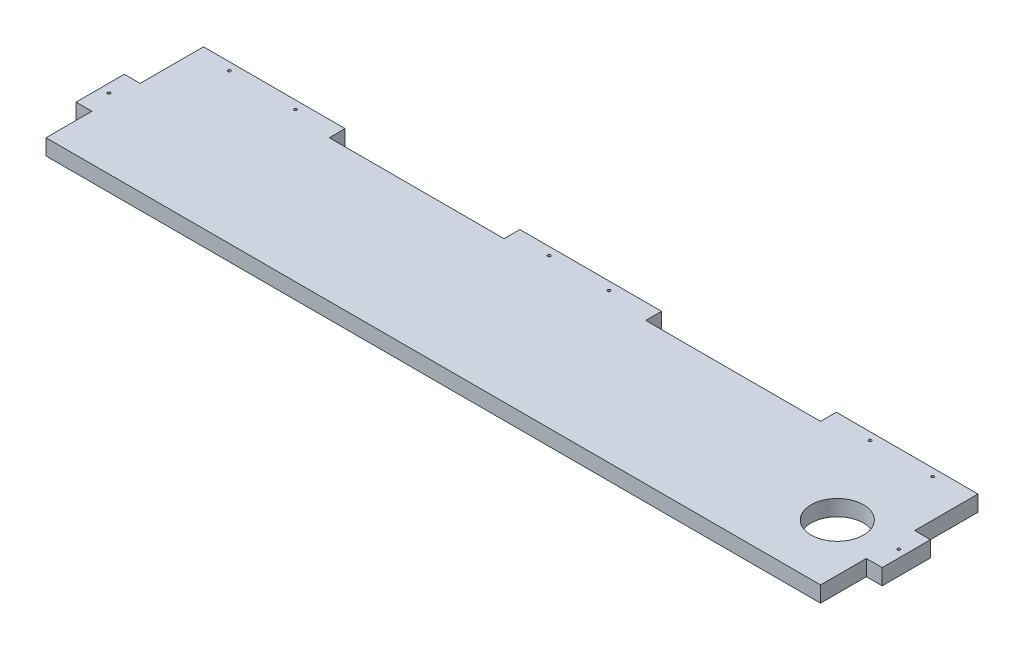
ISO-10303-21;
HEADER;
FILE_DESCRIPTION(('STEP AP214'),'2;1');
FILE_NAME('part.step','',(''),(''),'','','');
FILE_SCHEMA(('AUTOMOTIVE_DESIGN { 1 0 10303 214 1 1 1 1 }'));
ENDSEC;
DATA;
#1=APPLICATION_CONTEXT('core data for automotive mechanical design processes');
#2=APPLICATION_PROTOCOL_DEFINITION('international standard','automotive_design',2000,#1);
#3=PRODUCT_CONTEXT('',#1,'mechanical');
#4=PRODUCT('Part','Part','',(#3));
#5=PRODUCT_RELATED_PRODUCT_CATEGORY('part','',(#4));
#6=PRODUCT_DEFINITION_FORMATION('','',#4);
#7=PRODUCT_DEFINITION_CONTEXT('part definition',#1,'design');
#8=PRODUCT_DEFINITION('design','',#6,#7);
#9=PRODUCT_DEFINITION_SHAPE('','',#8);
#10=(LENGTH_UNIT() NAMED_UNIT(*) SI_UNIT(.MILLI.,.METRE.));
#11=(NAMED_UNIT(*) PLANE_ANGLE_UNIT() SI_UNIT($,.RADIAN.));
#12=(NAMED_UNIT(*) SI_UNIT($,.STERADIAN.) SOLID_ANGLE_UNIT());
#13=UNCERTAINTY_MEASURE_WITH_UNIT(LENGTH_MEASURE(1.E-05),#10,'distance_accuracy_value','');
#14=(GEOMETRIC_REPRESENTATION_CONTEXT(3) GLOBAL_UNCERTAINTY_ASSIGNED_CONTEXT((#13)) GLOBAL_UNIT_ASSIGNED_CONTEXT((#10,
#11,#12)) REPRESENTATION_CONTEXT('',''));
#15=CARTESIAN_POINT('',(0.,0.,0.));
#16=DIRECTION('',(0.,0.,1.));
#17=DIRECTION('',(1.,0.,0.));
#18=AXIS2_PLACEMENT_3D('',#15,#16,#17);
#19=CARTESIAN_POINT('',(-1878.01840884108,3374.03154429096,189.));
#20=DIRECTION('',(0.,-1.,0.));
#21=DIRECTION('',(0.,0.,-1.));
#22=AXIS2_PLACEMENT_3D('',#19,#20,#21);
#23=PLANE('',#22);
#24=CARTESIAN_POINT('',(-993.687537487218,3374.03154429096,9.0847005836633));
#25=DIRECTION('',(0.,1.,0.));
#26=DIRECTION('',(0.,0.,1.));
#27=AXIS2_PLACEMENT_3D('',#24,#25,#26);
#28=CIRCLE('',#27,1.70000000000003);
#29=CARTESIAN_POINT('',(-993.687537487218,3374.03154429096,10.7847005836633));
#30=VERTEX_POINT('',#29);
#31=EDGE_CURVE('E717',#30,#30,#28,.T.);
#32=ORIENTED_EDGE('',*,*,#31,.F.);
#33=EDGE_LOOP('',(#32));
#34=FACE_BOUND('',#33,.T.);
#35=CARTESIAN_POINT('',(-1068.92238905759,3374.03154429096,9.0847005836633));
#36=DIRECTION('',(0.,1.,0.));
#37=DIRECTION('',(0.,0.,1.));
#38=AXIS2_PLACEMENT_3D('',#35,#36,#37);
#39=CIRCLE('',#38,1.70000000000003);
#40=CARTESIAN_POINT('',(-1068.92238905759,3374.03154429096,10.7847005836633));
#41=VERTEX_POINT('',#40);
#42=EDGE_CURVE('E719',#41,#41,#39,.T.);
#43=ORIENTED_EDGE('',*,*,#42,.F.);
#44=EDGE_LOOP('',(#43));
#45=FACE_BOUND('',#44,.T.);
#46=CARTESIAN_POINT('',(-1453.57381328359,3374.03154429096,9.61452348204585));
#47=DIRECTION('',(0.,1.,0.));
#48=DIRECTION('',(0.,0.,1.));
#49=AXIS2_PLACEMENT_3D('',#46,#47,#48);
#50=CIRCLE('',#49,1.70000000000003);
#51=CARTESIAN_POINT('',(-1453.57381328359,3374.03154429096,11.3145234820459));
#52=VERTEX_POINT('',#51);
#53=EDGE_CURVE('E725',#52,#52,#50,.T.);
#54=ORIENTED_EDGE('',*,*,#53,.F.);
#55=EDGE_LOOP('',(#54));
#56=FACE_BOUND('',#55,.T.);
#57=CARTESIAN_POINT('',(-1757.52295911213,3374.03154429096,9.98064592888394));
#58=DIRECTION('',(0.,1.,0.));
#59=DIRECTION('',(0.,0.,1.));
#60=AXIS2_PLACEMENT_3D('',#57,#58,#59);
#61=CIRCLE('',#60,1.70000000000003);
#62=CARTESIAN_POINT('',(-1757.52295911213,3374.03154429096,11.680645928884));
#63=VERTEX_POINT('',#62);
#64=EDGE_CURVE('E729',#63,#63,#61,.T.);
#65=ORIENTED_EDGE('',*,*,#64,.F.);
#66=EDGE_LOOP('',(#65));
#67=FACE_BOUND('',#66,.T.);
#68=CARTESIAN_POINT('',(-1837.60945529256,3374.03154429096,9.35497017747501));
#69=DIRECTION('',(0.,1.,0.));
#70=DIRECTION('',(0.,0.,1.));
#71=AXIS2_PLACEMENT_3D('',#68,#69,#70);
#72=CIRCLE('',#71,1.70000000000003);
#73=CARTESIAN_POINT('',(-1837.60945529256,3374.03154429096,11.054970177475));
#74=VERTEX_POINT('',#73);
#75=EDGE_CURVE('E733',#74,#74,#72,.T.);
#76=ORIENTED_EDGE('',*,*,#75,.F.);
#77=EDGE_LOOP('',(#76));
#78=FACE_BOUND('',#77,.T.);
#79=CARTESIAN_POINT('',(-1381.23942270364,3374.03154429096,10.0245755343759));
#80=DIRECTION('',(0.,1.,0.));
#81=DIRECTION('',(0.,0.,1.));
#82=AXIS2_PLACEMENT_3D('',#79,#80,#81);
#83=CIRCLE('',#82,1.70000000000003);
#84=CARTESIAN_POINT('',(-1381.23942270364,3374.03154429096,11.7245755343759));
#85=VERTEX_POINT('',#84);
#86=EDGE_CURVE('E737',#85,#85,#83,.T.);
#87=ORIENTED_EDGE('',*,*,#86,.F.);
#88=EDGE_LOOP('',(#87));
#89=FACE_BOUND('',#88,.T.);
#90=CARTESIAN_POINT('',(-938.477894694233,3374.03154429096,104.971595660942));
#91=DIRECTION('',(0.,1.,0.));
#92=DIRECTION('',(0.,0.,1.));
#93=AXIS2_PLACEMENT_3D('',#90,#91,#92);
#94=CIRCLE('',#93,1.70000000000003);
#95=CARTESIAN_POINT('',(-938.477894694233,3374.03154429096,106.671595660942));
#96=VERTEX_POINT('',#95);
#97=EDGE_CURVE('E741',#96,#96,#94,.T.);
#98=ORIENTED_EDGE('',*,*,#97,.F.);
#99=EDGE_LOOP('',(#98));
#100=FACE_BOUND('',#99,.T.);
#101=CARTESIAN_POINT('',(-1005.92382658818,3374.03154429096,111.37088114683));
#102=DIRECTION('',(0.,1.,0.));
#103=DIRECTION('',(0.,0.,1.));
#104=AXIS2_PLACEMENT_3D('',#101,#102,#103);
#105=CIRCLE('',#104,31.4746452947954);
#106=CARTESIAN_POINT('',(-1005.92382658818,3374.03154429096,142.845526441626));
#107=VERTEX_POINT('',#106);
#108=EDGE_CURVE('E193',#107,#107,#105,.T.);
#109=ORIENTED_EDGE('',*,*,#108,.F.);
#110=EDGE_LOOP('',(#109));
#111=FACE_BOUND('',#110,.T.);
#112=DIRECTION('',(0.,0.,-1.));
#113=VECTOR('',#112,1.);
#114=CARTESIAN_POINT('',(-948.418408841076,3374.03154429096,189.));
#115=LINE('',#114,#113);
#116=CARTESIAN_POINT('',(-948.418408841076,3374.03154429096,189.));
#117=VERTEX_POINT('',#116);
#118=CARTESIAN_POINT('',(-948.418408841076,3374.03154429096,134.));
#119=VERTEX_POINT('',#118);
#120=EDGE_CURVE('E349',#117,#119,#115,.T.);
#121=ORIENTED_EDGE('',*,*,#120,.T.);
#122=DIRECTION('',(-1.,0.,0.));
#123=VECTOR('',#122,1.);
#124=CARTESIAN_POINT('',(-929.418408841076,3374.03154429096,134.));
#125=LINE('',#124,#123);
#126=CARTESIAN_POINT('',(-929.418408841076,3374.03154429096,134.));
#127=VERTEX_POINT('',#126);
#128=EDGE_CURVE('E751',#127,#119,#125,.T.);
#129=ORIENTED_EDGE('',*,*,#128,.F.);
#130=DIRECTION('',(0.,0.,1.));
#131=VECTOR('',#130,1.);
#132=CARTESIAN_POINT('',(-929.418408841076,3374.03154429096,134.));
#133=LINE('',#132,#131);
#134=CARTESIAN_POINT('',(-929.418408841076,3374.03154429096,76.));
#135=VERTEX_POINT('',#134);
#136=EDGE_CURVE('E187',#135,#127,#133,.T.);
#137=ORIENTED_EDGE('',*,*,#136,.F.);
#138=DIRECTION('',(-1.,0.,0.));
#139=VECTOR('',#138,1.);
#140=CARTESIAN_POINT('',(-929.418408841076,3374.03154429096,76.));
#141=LINE('',#140,#139);
#142=CARTESIAN_POINT('',(-948.418408841076,3374.03154429096,76.));
#143=VERTEX_POINT('',#142);
#144=EDGE_CURVE('E198',#135,#143,#141,.T.);
#145=ORIENTED_EDGE('',*,*,#144,.T.);
#146=CARTESIAN_POINT('',(-948.418408841076,3374.03154429096,0.));
#147=VERTEX_POINT('',#146);
#148=EDGE_CURVE('E348',#143,#147,#115,.T.);
#149=ORIENTED_EDGE('',*,*,#148,.T.);
#150=DIRECTION('',(1.,0.,0.));
#151=VECTOR('',#150,1.);
#152=CARTESIAN_POINT('',(-1118.41840884108,3374.03154429096,0.));
#153=LINE('',#152,#151);
#154=CARTESIAN_POINT('',(-1118.41840884108,3374.03154429096,0.));
#155=VERTEX_POINT('',#154);
#156=EDGE_CURVE('E218',#155,#147,#153,.T.);
#157=ORIENTED_EDGE('',*,*,#156,.F.);
#158=DIRECTION('',(0.,0.,1.));
#159=VECTOR('',#158,1.);
#160=CARTESIAN_POINT('',(-1118.41840884108,3374.03154429096,-19.));
#161=LINE('',#160,#159);
#162=CARTESIAN_POINT('',(-1118.41840884108,3374.03154429096,19.));
#163=VERTEX_POINT('',#162);
#164=EDGE_CURVE('E210',#155,#163,#161,.T.);
#165=ORIENTED_EDGE('',*,*,#164,.T.);
#166=DIRECTION('',(-1.,0.,0.));
#167=VECTOR('',#166,1.);
#168=CARTESIAN_POINT('',(-1878.01840884108,3374.03154429096,19.));
#169=LINE('',#168,#167);
#170=CARTESIAN_POINT('',(-1328.21840884108,3374.03154429096,19.));
#171=VERTEX_POINT('',#170);
#172=EDGE_CURVE('E333',#163,#171,#169,.T.);
#173=ORIENTED_EDGE('',*,*,#172,.T.);
#174=DIRECTION('',(0.,0.,1.));
#175=VECTOR('',#174,1.);
#176=CARTESIAN_POINT('',(-1328.21840884108,3374.03154429096,-19.));
#177=LINE('',#176,#175);
#178=CARTESIAN_POINT('',(-1328.21840884108,3374.03154429096,0.));
#179=VERTEX_POINT('',#178);
#180=EDGE_CURVE('E237',#179,#171,#177,.T.);
#181=ORIENTED_EDGE('',*,*,#180,.F.);
#182=DIRECTION('',(1.,0.,0.));
#183=VECTOR('',#182,1.);
#184=CARTESIAN_POINT('',(-1498.21840884108,3374.03154429096,0.));
#185=LINE('',#184,#183);
#186=CARTESIAN_POINT('',(-1498.21840884108,3374.03154429096,0.));
#187=VERTEX_POINT('',#186);
#188=EDGE_CURVE('E254',#187,#179,#185,.T.);
#189=ORIENTED_EDGE('',*,*,#188,.F.);
#190=DIRECTION('',(0.,0.,1.));
#191=VECTOR('',#190,1.);
#192=CARTESIAN_POINT('',(-1498.21840884108,3374.03154429096,-19.));
#193=LINE('',#192,#191);
#194=CARTESIAN_POINT('',(-1498.21840884108,3374.03154429096,19.));
#195=VERTEX_POINT('',#194);
#196=EDGE_CURVE('E246',#187,#195,#193,.T.);
#197=ORIENTED_EDGE('',*,*,#196,.T.);
#198=CARTESIAN_POINT('',(-1708.01840884108,3374.03154429096,19.));
#199=VERTEX_POINT('',#198);
#200=EDGE_CURVE('E343',#195,#199,#169,.T.);
#201=ORIENTED_EDGE('',*,*,#200,.T.);
#202=DIRECTION('',(0.,0.,1.));
#203=VECTOR('',#202,1.);
#204=CARTESIAN_POINT('',(-1708.01840884108,3374.03154429096,-19.));
#205=LINE('',#204,#203);
#206=CARTESIAN_POINT('',(-1708.01840884108,3374.03154429096,0.));
#207=VERTEX_POINT('',#206);
#208=EDGE_CURVE('E253',#207,#199,#205,.T.);
#209=ORIENTED_EDGE('',*,*,#208,.F.);
#210=DIRECTION('',(1.,0.,0.));
#211=VECTOR('',#210,1.);
#212=CARTESIAN_POINT('',(-1878.01840884108,3374.03154429096,0.));
#213=LINE('',#212,#211);
#214=CARTESIAN_POINT('',(-1878.01840884108,3374.03154429096,0.));
#215=VERTEX_POINT('',#214);
#216=EDGE_CURVE('E284',#215,#207,#213,.T.);
#217=ORIENTED_EDGE('',*,*,#216,.F.);
#218=DIRECTION('',(0.,0.,-1.));
#219=VECTOR('',#218,1.);
#220=CARTESIAN_POINT('',(-1878.01840884108,3374.03154429096,189.));
#221=LINE('',#220,#219);
#222=CARTESIAN_POINT('',(-1878.01840884108,3374.03154429096,76.));
#223=VERTEX_POINT('',#222);
#224=EDGE_CURVE('E339',#223,#215,#221,.T.);
#225=ORIENTED_EDGE('',*,*,#224,.F.);
#226=DIRECTION('',(1.,0.,0.));
#227=VECTOR('',#226,1.);
#228=CARTESIAN_POINT('',(-1916.01840884108,3374.03154429096,76.));
#229=LINE('',#228,#227);
#230=CARTESIAN_POINT('',(-1897.01840884108,3374.03154429096,76.));
#231=VERTEX_POINT('',#230);
#232=EDGE_CURVE('E317',#231,#223,#229,.T.);
#233=ORIENTED_EDGE('',*,*,#232,.F.);
#234=DIRECTION('',(0.,0.,-1.));
#235=VECTOR('',#234,1.);
#236=CARTESIAN_POINT('',(-1897.01840884108,3374.03154429096,76.));
#237=LINE('',#236,#235);
#238=CARTESIAN_POINT('',(-1897.01840884108,3374.03154429096,134.));
#239=VERTEX_POINT('',#238);
#240=EDGE_CURVE('E304',#239,#231,#237,.T.);
#241=ORIENTED_EDGE('',*,*,#240,.F.);
#242=DIRECTION('',(1.,0.,0.));
#243=VECTOR('',#242,1.);
#244=CARTESIAN_POINT('',(-1916.01840884108,3374.03154429096,134.));
#245=LINE('',#244,#243);
#246=CARTESIAN_POINT('',(-1878.01840884108,3374.03154429096,134.));
#247=VERTEX_POINT('',#246);
#248=EDGE_CURVE('E324',#239,#247,#245,.T.);
#249=ORIENTED_EDGE('',*,*,#248,.T.);
#250=CARTESIAN_POINT('',(-1878.01840884108,3374.03154429096,189.));
#251=VERTEX_POINT('',#250);
#252=EDGE_CURVE('E345',#251,#247,#221,.T.);
#253=ORIENTED_EDGE('',*,*,#252,.F.);
#254=DIRECTION('',(-1.,0.,0.));
#255=VECTOR('',#254,1.);
#256=CARTESIAN_POINT('',(-1878.01840884108,3374.03154429096,189.));
#257=LINE('',#256,#255);
#258=EDGE_CURVE('E337',#117,#251,#257,.T.);
#259=ORIENTED_EDGE('',*,*,#258,.F.);
#260=EDGE_LOOP('',(#121,#129,#137,#145,#149,#157,#165,#173,#181,#189,#197,#201,#209,#217,#225,
#233,#241,#249,#253,#259));
#261=FACE_BOUND('',#260,.T.);
#262=CARTESIAN_POINT('',(-1886.75619490167,3374.03154429096,104.854140946122));
#263=DIRECTION('',(0.,1.,0.));
#264=DIRECTION('',(0.,0.,1.));
#265=AXIS2_PLACEMENT_3D('',#262,#263,#264);
#266=CIRCLE('',#265,1.70000000000003);
#267=CARTESIAN_POINT('',(-1886.75619490167,3374.03154429096,106.554140946122));
#268=VERTEX_POINT('',#267);
#269=EDGE_CURVE('E745',#268,#268,#266,.T.);
#270=ORIENTED_EDGE('',*,*,#269,.F.);
#271=EDGE_LOOP('',(#270));
#272=FACE_BOUND('',#271,.T.);
#273=ADVANCED_FACE('F33',(#34,#45,#56,#67,#78,#89,#100,#111,#261,#272),#23,.F.);
#274=CARTESIAN_POINT('',(-948.418408841076,3374.03154429096,189.));
#275=DIRECTION('',(-1.,0.,0.));
#276=DIRECTION('',(0.,-1.,0.));
#277=AXIS2_PLACEMENT_3D('',#274,#275,#276);
#278=PLANE('',#277);
#279=DIRECTION('',(0.,-1.,0.));
#280=VECTOR('',#279,1.);
#281=CARTESIAN_POINT('',(-948.418408841076,3374.03154429096,134.));
#282=LINE('',#281,#280);
#283=CARTESIAN_POINT('',(-948.418408841076,3355.03154429096,134.));
#284=VERTEX_POINT('',#283);
#285=EDGE_CURVE('E48',#119,#284,#282,.T.);
#286=ORIENTED_EDGE('',*,*,#285,.F.);
#287=ORIENTED_EDGE('',*,*,#120,.F.);
#288=DIRECTION('',(0.,1.,0.));
#289=VECTOR('',#288,1.);
#290=CARTESIAN_POINT('',(-948.418408841076,3374.03154429096,189.));
#291=LINE('',#290,#289);
#292=CARTESIAN_POINT('',(-948.418408841076,3355.03154429096,189.));
#293=VERTEX_POINT('',#292);
#294=EDGE_CURVE('E335',#293,#117,#291,.T.);
#295=ORIENTED_EDGE('',*,*,#294,.F.);
#296=DIRECTION('',(0.,0.,-1.));
#297=VECTOR('',#296,1.);
#298=CARTESIAN_POINT('',(-948.418408841076,3355.03154429096,189.));
#299=LINE('',#298,#297);
#300=EDGE_CURVE('E351',#293,#284,#299,.T.);
#301=ORIENTED_EDGE('',*,*,#300,.T.);
#302=EDGE_LOOP('',(#286,#287,#295,#301));
#303=FACE_BOUND('',#302,.T.);
#304=ADVANCED_FACE('F417',(#303),#278,.F.);
#305=DIRECTION('',(0.,1.,0.));
#306=VECTOR('',#305,1.);
#307=CARTESIAN_POINT('',(-948.418408841076,3374.03154429096,76.));
#308=LINE('',#307,#306);
#309=CARTESIAN_POINT('',(-948.418408841076,3355.03154429096,76.));
#310=VERTEX_POINT('',#309);
#311=EDGE_CURVE('E56',#310,#143,#308,.T.);
#312=ORIENTED_EDGE('',*,*,#311,.F.);
#313=CARTESIAN_POINT('',(-948.418408841076,3355.03154429096,0.));
#314=VERTEX_POINT('',#313);
#315=EDGE_CURVE('E350',#310,#314,#299,.T.);
#316=ORIENTED_EDGE('',*,*,#315,.T.);
#317=DIRECTION('',(0.,-1.,0.));
#318=VECTOR('',#317,1.);
#319=CARTESIAN_POINT('',(-948.418408841076,3374.03154429096,0.));
#320=LINE('',#319,#318);
#321=EDGE_CURVE('E211',#147,#314,#320,.T.);
#322=ORIENTED_EDGE('',*,*,#321,.F.);
#323=ORIENTED_EDGE('',*,*,#148,.F.);
#324=EDGE_LOOP('',(#312,#316,#322,#323));
#325=FACE_BOUND('',#324,.T.);
#326=ADVANCED_FACE('F355',(#325),#278,.F.);
#327=CARTESIAN_POINT('',(0.,0.,19.));
#328=DIRECTION('',(0.,0.,1.));
#329=DIRECTION('',(1.,0.,0.));
#330=AXIS2_PLACEMENT_3D('',#327,#328,#329);
#331=PLANE('',#330);
#332=CARTESIAN_POINT('',(-1118.41840884108,3355.03154429096,19.));
#333=CARTESIAN_POINT('',(-1118.41840884108,3374.03154429096,19.));
#334=B_SPLINE_CURVE_WITH_KNOTS('',1,(#332,#333),.UNSPECIFIED.,.F.,.F.,(2,2),(0.,
0.0502645502645506),.UNSPECIFIED.);
#335=CARTESIAN_POINT('',(-1118.41840884108,3355.03154429096,19.));
#336=VERTEX_POINT('',#335);
#337=EDGE_CURVE('E205',#336,#163,#334,.T.);
#338=ORIENTED_EDGE('',*,*,#337,.F.);
#339=DIRECTION('',(1.,0.,0.));
#340=VECTOR('',#339,1.);
#341=CARTESIAN_POINT('',(-1878.01840884108,3355.03154429096,19.));
#342=LINE('',#341,#340);
#343=CARTESIAN_POINT('',(-1328.21840884108,3355.03154429096,19.));
#344=VERTEX_POINT('',#343);
#345=EDGE_CURVE('E328',#344,#336,#342,.T.);
#346=ORIENTED_EDGE('',*,*,#345,.F.);
#347=CARTESIAN_POINT('',(-1328.21840884108,3374.03154429096,19.));
#348=CARTESIAN_POINT('',(-1328.21840884108,3355.03154429096,19.));
#349=B_SPLINE_CURVE_WITH_KNOTS('',1,(#347,#348),.UNSPECIFIED.,.F.,.F.,(2,2),(0.5,
0.550264550264551),.UNSPECIFIED.);
#350=EDGE_CURVE('E231',#171,#344,#349,.T.);
#351=ORIENTED_EDGE('',*,*,#350,.F.);
#352=ORIENTED_EDGE('',*,*,#172,.F.);
#353=EDGE_LOOP('',(#338,#346,#351,#352));
#354=FACE_BOUND('',#353,.T.);
#355=ADVANCED_FACE('F367',(#354),#331,.F.);
#356=CARTESIAN_POINT('',(-1498.21840884108,3355.03154429096,19.));
#357=CARTESIAN_POINT('',(-1498.21840884108,3374.03154429096,19.));
#358=B_SPLINE_CURVE_WITH_KNOTS('',1,(#356,#357),.UNSPECIFIED.,.F.,.F.,(2,2),(0.,
0.0502645502645506),.UNSPECIFIED.);
#359=CARTESIAN_POINT('',(-1498.21840884108,3355.03154429096,19.));
#360=VERTEX_POINT('',#359);
#361=EDGE_CURVE('E238',#360,#195,#358,.T.);
#362=ORIENTED_EDGE('',*,*,#361,.F.);
#363=CARTESIAN_POINT('',(-1708.01840884108,3355.03154429096,19.));
#364=VERTEX_POINT('',#363);
#365=EDGE_CURVE('E340',#364,#360,#342,.T.);
#366=ORIENTED_EDGE('',*,*,#365,.F.);
#367=CARTESIAN_POINT('',(-1708.01840884108,3374.03154429096,19.));
#368=CARTESIAN_POINT('',(-1708.01840884108,3355.03154429096,19.));
#369=B_SPLINE_CURVE_WITH_KNOTS('',1,(#367,#368),.UNSPECIFIED.,.F.,.F.,(2,2),(0.5,
0.550264550264551),.UNSPECIFIED.);
#370=EDGE_CURVE('E271',#199,#364,#369,.T.);
#371=ORIENTED_EDGE('',*,*,#370,.F.);
#372=ORIENTED_EDGE('',*,*,#200,.F.);
#373=EDGE_LOOP('',(#362,#366,#371,#372));
#374=FACE_BOUND('',#373,.T.);
#375=ADVANCED_FACE('F383',(#374),#331,.F.);
#376=CARTESIAN_POINT('',(-1878.01840884108,3374.03154429096,189.));
#377=DIRECTION('',(1.,0.,0.));
#378=DIRECTION('',(0.,0.,-1.));
#379=AXIS2_PLACEMENT_3D('',#376,#377,#378);
#380=PLANE('',#379);
#381=DIRECTION('',(0.,0.,-1.));
#382=VECTOR('',#381,1.);
#383=CARTESIAN_POINT('',(-1878.01840884108,3355.03154429096,189.));
#384=LINE('',#383,#382);
#385=CARTESIAN_POINT('',(-1878.01840884108,3355.03154429096,76.));
#386=VERTEX_POINT('',#385);
#387=CARTESIAN_POINT('',(-1878.01840884108,3355.03154429096,0.));
#388=VERTEX_POINT('',#387);
#389=EDGE_CURVE('E41',#386,#388,#384,.T.);
#390=ORIENTED_EDGE('',*,*,#389,.F.);
#391=CARTESIAN_POINT('',(-1878.01840884108,3355.03154429096,76.));
#392=CARTESIAN_POINT('',(-1878.01840884108,3374.03154429096,76.));
#393=B_SPLINE_CURVE_WITH_KNOTS('',1,(#391,#392),.UNSPECIFIED.,.F.,.F.,(2,2),(0.,
0.123376623376624),.UNSPECIFIED.);
#394=EDGE_CURVE('E283',#386,#223,#393,.T.);
#395=ORIENTED_EDGE('',*,*,#394,.T.);
#396=ORIENTED_EDGE('',*,*,#224,.T.);
#397=DIRECTION('',(0.,1.,0.));
#398=VECTOR('',#397,1.);
#399=CARTESIAN_POINT('',(-1878.01840884108,3355.03154429096,0.));
#400=LINE('',#399,#398);
#401=EDGE_CURVE('E287',#388,#215,#400,.T.);
#402=ORIENTED_EDGE('',*,*,#401,.F.);
#403=EDGE_LOOP('',(#390,#395,#396,#402));
#404=FACE_BOUND('',#403,.T.);
#405=ADVANCED_FACE('F395',(#404),#380,.F.);
#406=ORIENTED_EDGE('',*,*,#252,.T.);
#407=CARTESIAN_POINT('',(-1878.01840884108,3374.03154429096,134.));
#408=CARTESIAN_POINT('',(-1878.01840884108,3355.03154429096,134.));
#409=B_SPLINE_CURVE_WITH_KNOTS('',1,(#407,#408),.UNSPECIFIED.,.F.,.F.,(2,2),(0.5,
0.623376623376624),.UNSPECIFIED.);
#410=CARTESIAN_POINT('',(-1878.01840884108,3355.03154429096,134.));
#411=VERTEX_POINT('',#410);
#412=EDGE_CURVE('E309',#247,#411,#409,.T.);
#413=ORIENTED_EDGE('',*,*,#412,.T.);
#414=CARTESIAN_POINT('',(-1878.01840884108,3355.03154429096,189.));
#415=VERTEX_POINT('',#414);
#416=EDGE_CURVE('E11',#415,#411,#384,.T.);
#417=ORIENTED_EDGE('',*,*,#416,.F.);
#418=DIRECTION('',(0.,-1.,0.));
#419=VECTOR('',#418,1.);
#420=CARTESIAN_POINT('',(-1878.01840884108,3374.03154429096,189.));
#421=LINE('',#420,#419);
#422=EDGE_CURVE('E329',#251,#415,#421,.T.);
#423=ORIENTED_EDGE('',*,*,#422,.F.);
#424=EDGE_LOOP('',(#406,#413,#417,#423));
#425=FACE_BOUND('',#424,.T.);
#426=ADVANCED_FACE('F35',(#425),#380,.F.);
#427=CARTESIAN_POINT('',(-1878.01840884108,3355.03154429096,189.));
#428=DIRECTION('',(0.,1.,0.));
#429=DIRECTION('',(0.,0.,1.));
#430=AXIS2_PLACEMENT_3D('',#427,#428,#429);
#431=PLANE('',#430);
#432=CARTESIAN_POINT('',(-993.687537487218,3355.03154429096,9.0847005836633));
#433=DIRECTION('',(0.,1.,0.));
#434=DIRECTION('',(0.,0.,1.));
#435=AXIS2_PLACEMENT_3D('',#432,#433,#434);
#436=CIRCLE('',#435,1.70000000000003);
#437=CARTESIAN_POINT('',(-993.687537487218,3355.03154429096,10.7847005836633));
#438=VERTEX_POINT('',#437);
#439=EDGE_CURVE('E437',#438,#438,#436,.T.);
#440=ORIENTED_EDGE('',*,*,#439,.T.);
#441=EDGE_LOOP('',(#440));
#442=FACE_BOUND('',#441,.T.);
#443=CARTESIAN_POINT('',(-1068.92238905759,3355.03154429096,9.0847005836633));
#444=DIRECTION('',(0.,1.,0.));
#445=DIRECTION('',(0.,0.,1.));
#446=AXIS2_PLACEMENT_3D('',#443,#444,#445);
#447=CIRCLE('',#446,1.70000000000003);
#448=CARTESIAN_POINT('',(-1068.92238905759,3355.03154429096,10.7847005836633));
#449=VERTEX_POINT('',#448);
#450=EDGE_CURVE('E441',#449,#449,#447,.T.);
#451=ORIENTED_EDGE('',*,*,#450,.T.);
#452=EDGE_LOOP('',(#451));
#453=FACE_BOUND('',#452,.T.);
#454=CARTESIAN_POINT('',(-1453.57381328359,3355.03154429096,9.61452348204585));
#455=DIRECTION('',(0.,1.,0.));
#456=DIRECTION('',(0.,0.,1.));
#457=AXIS2_PLACEMENT_3D('',#454,#455,#456);
#458=CIRCLE('',#457,1.70000000000003);
#459=CARTESIAN_POINT('',(-1453.57381328359,3355.03154429096,11.3145234820459));
#460=VERTEX_POINT('',#459);
#461=EDGE_CURVE('E445',#460,#460,#458,.T.);
#462=ORIENTED_EDGE('',*,*,#461,.T.);
#463=EDGE_LOOP('',(#462));
#464=FACE_BOUND('',#463,.T.);
#465=CARTESIAN_POINT('',(-1757.52295911213,3355.03154429096,9.98064592888394));
#466=DIRECTION('',(0.,1.,0.));
#467=DIRECTION('',(0.,0.,1.));
#468=AXIS2_PLACEMENT_3D('',#465,#466,#467);
#469=CIRCLE('',#468,1.70000000000003);
#470=CARTESIAN_POINT('',(-1757.52295911213,3355.03154429096,11.680645928884));
#471=VERTEX_POINT('',#470);
#472=EDGE_CURVE('E449',#471,#471,#469,.T.);
#473=ORIENTED_EDGE('',*,*,#472,.T.);
#474=EDGE_LOOP('',(#473));
#475=FACE_BOUND('',#474,.T.);
#476=CARTESIAN_POINT('',(-1837.60945529256,3355.03154429096,9.35497017747501));
#477=DIRECTION('',(0.,1.,0.));
#478=DIRECTION('',(0.,0.,1.));
#479=AXIS2_PLACEMENT_3D('',#476,#477,#478);
#480=CIRCLE('',#479,1.70000000000003);
#481=CARTESIAN_POINT('',(-1837.60945529256,3355.03154429096,11.054970177475));
#482=VERTEX_POINT('',#481);
#483=EDGE_CURVE('E453',#482,#482,#480,.T.);
#484=ORIENTED_EDGE('',*,*,#483,.T.);
#485=EDGE_LOOP('',(#484));
#486=FACE_BOUND('',#485,.T.);
#487=CARTESIAN_POINT('',(-1381.23942270364,3355.03154429096,10.0245755343759));
#488=DIRECTION('',(0.,1.,0.));
#489=DIRECTION('',(0.,0.,1.));
#490=AXIS2_PLACEMENT_3D('',#487,#488,#489);
#491=CIRCLE('',#490,1.70000000000003);
#492=CARTESIAN_POINT('',(-1381.23942270364,3355.03154429096,11.7245755343759));
#493=VERTEX_POINT('',#492);
#494=EDGE_CURVE('E457',#493,#493,#491,.T.);
#495=ORIENTED_EDGE('',*,*,#494,.T.);
#496=EDGE_LOOP('',(#495));
#497=FACE_BOUND('',#496,.T.);
#498=CARTESIAN_POINT('',(-938.477894694233,3355.03154429096,104.971595660942));
#499=DIRECTION('',(0.,1.,0.));
#500=DIRECTION('',(0.,0.,1.));
#501=AXIS2_PLACEMENT_3D('',#498,#499,#500);
#502=CIRCLE('',#501,1.70000000000003);
#503=CARTESIAN_POINT('',(-938.477894694233,3355.03154429096,106.671595660942));
#504=VERTEX_POINT('',#503);
#505=EDGE_CURVE('E461',#504,#504,#502,.T.);
#506=ORIENTED_EDGE('',*,*,#505,.T.);
#507=EDGE_LOOP('',(#506));
#508=FACE_BOUND('',#507,.T.);
#509=CARTESIAN_POINT('',(-1886.75619490167,3355.03154429096,104.854140946122));
#510=DIRECTION('',(0.,1.,0.));
#511=DIRECTION('',(0.,0.,1.));
#512=AXIS2_PLACEMENT_3D('',#509,#510,#511);
#513=CIRCLE('',#512,1.70000000000003);
#514=CARTESIAN_POINT('',(-1886.75619490167,3355.03154429096,106.554140946122));
#515=VERTEX_POINT('',#514);
#516=EDGE_CURVE('E465',#515,#515,#513,.T.);
#517=ORIENTED_EDGE('',*,*,#516,.T.);
#518=EDGE_LOOP('',(#517));
#519=FACE_BOUND('',#518,.T.);
#520=CARTESIAN_POINT('',(-1005.92382658818,3355.03154429096,111.37088114683));
#521=DIRECTION('',(0.,1.,0.));
#522=DIRECTION('',(0.,0.,1.));
#523=AXIS2_PLACEMENT_3D('',#520,#521,#522);
#524=CIRCLE('',#523,31.4746452947954);
#525=CARTESIAN_POINT('',(-1005.92382658818,3355.03154429096,142.845526441626));
#526=VERTEX_POINT('',#525);
#527=EDGE_CURVE('E196',#526,#526,#524,.T.);
#528=ORIENTED_EDGE('',*,*,#527,.T.);
#529=EDGE_LOOP('',(#528));
#530=FACE_BOUND('',#529,.T.);
#531=ORIENTED_EDGE('',*,*,#389,.T.);
#532=DIRECTION('',(-1.,0.,0.));
#533=VECTOR('',#532,1.);
#534=CARTESIAN_POINT('',(-1708.01840884108,3355.03154429096,0.));
#535=LINE('',#534,#533);
#536=CARTESIAN_POINT('',(-1708.01840884108,3355.03154429096,0.));
#537=VERTEX_POINT('',#536);
#538=EDGE_CURVE('E290',#537,#388,#535,.T.);
#539=ORIENTED_EDGE('',*,*,#538,.F.);
#540=DIRECTION('',(0.,0.,1.));
#541=VECTOR('',#540,1.);
#542=CARTESIAN_POINT('',(-1708.01840884108,3355.03154429096,-19.));
#543=LINE('',#542,#541);
#544=EDGE_CURVE('E276',#537,#364,#543,.T.);
#545=ORIENTED_EDGE('',*,*,#544,.T.);
#546=ORIENTED_EDGE('',*,*,#365,.T.);
#547=DIRECTION('',(0.,0.,1.));
#548=VECTOR('',#547,1.);
#549=CARTESIAN_POINT('',(-1498.21840884108,3355.03154429096,-19.));
#550=LINE('',#549,#548);
#551=CARTESIAN_POINT('',(-1498.21840884108,3355.03154429096,0.));
#552=VERTEX_POINT('',#551);
#553=EDGE_CURVE('E217',#552,#360,#550,.T.);
#554=ORIENTED_EDGE('',*,*,#553,.F.);
#555=DIRECTION('',(-1.,0.,0.));
#556=VECTOR('',#555,1.);
#557=CARTESIAN_POINT('',(-1328.21840884108,3355.03154429096,0.));
#558=LINE('',#557,#556);
#559=CARTESIAN_POINT('',(-1328.21840884108,3355.03154429096,0.));
#560=VERTEX_POINT('',#559);
#561=EDGE_CURVE('E260',#560,#552,#558,.T.);
#562=ORIENTED_EDGE('',*,*,#561,.F.);
#563=DIRECTION('',(0.,0.,1.));
#564=VECTOR('',#563,1.);
#565=CARTESIAN_POINT('',(-1328.21840884108,3355.03154429096,-19.));
#566=LINE('',#565,#564);
#567=EDGE_CURVE('E236',#560,#344,#566,.T.);
#568=ORIENTED_EDGE('',*,*,#567,.T.);
#569=ORIENTED_EDGE('',*,*,#345,.T.);
#570=DIRECTION('',(0.,0.,1.));
#571=VECTOR('',#570,1.);
#572=CARTESIAN_POINT('',(-1118.41840884108,3355.03154429096,-19.));
#573=LINE('',#572,#571);
#574=CARTESIAN_POINT('',(-1118.41840884108,3355.03154429096,0.));
#575=VERTEX_POINT('',#574);
#576=EDGE_CURVE('E203',#575,#336,#573,.T.);
#577=ORIENTED_EDGE('',*,*,#576,.F.);
#578=DIRECTION('',(-1.,0.,0.));
#579=VECTOR('',#578,1.);
#580=CARTESIAN_POINT('',(-948.418408841076,3355.03154429096,0.));
#581=LINE('',#580,#579);
#582=EDGE_CURVE('E224',#314,#575,#581,.T.);
#583=ORIENTED_EDGE('',*,*,#582,.F.);
#584=ORIENTED_EDGE('',*,*,#315,.F.);
#585=DIRECTION('',(-1.,0.,0.));
#586=VECTOR('',#585,1.);
#587=CARTESIAN_POINT('',(-929.418408841076,3355.03154429096,76.));
#588=LINE('',#587,#586);
#589=CARTESIAN_POINT('',(-929.418408841076,3355.03154429096,76.));
#590=VERTEX_POINT('',#589);
#591=EDGE_CURVE('E178',#590,#310,#588,.T.);
#592=ORIENTED_EDGE('',*,*,#591,.F.);
#593=DIRECTION('',(0.,0.,-1.));
#594=VECTOR('',#593,1.);
#595=CARTESIAN_POINT('',(-929.418408841076,3355.03154429096,134.));
#596=LINE('',#595,#594);
#597=CARTESIAN_POINT('',(-929.418408841076,3355.03154429096,134.));
#598=VERTEX_POINT('',#597);
#599=EDGE_CURVE('E171',#598,#590,#596,.T.);
#600=ORIENTED_EDGE('',*,*,#599,.F.);
#601=DIRECTION('',(-1.,0.,0.));
#602=VECTOR('',#601,1.);
#603=CARTESIAN_POINT('',(-929.418408841076,3355.03154429096,134.));
#604=LINE('',#603,#602);
#605=EDGE_CURVE('E176',#598,#284,#604,.T.);
#606=ORIENTED_EDGE('',*,*,#605,.T.);
#607=ORIENTED_EDGE('',*,*,#300,.F.);
#608=DIRECTION('',(1.,0.,0.));
#609=VECTOR('',#608,1.);
#610=CARTESIAN_POINT('',(-1878.01840884108,3355.03154429096,189.));
#611=LINE('',#610,#609);
#612=EDGE_CURVE('E332',#415,#293,#611,.T.);
#613=ORIENTED_EDGE('',*,*,#612,.F.);
#614=ORIENTED_EDGE('',*,*,#416,.T.);
#615=DIRECTION('',(1.,0.,0.));
#616=VECTOR('',#615,1.);
#617=CARTESIAN_POINT('',(-1916.01840884108,3355.03154429096,134.));
#618=LINE('',#617,#616);
#619=CARTESIAN_POINT('',(-1897.01840884108,3355.03154429096,134.));
#620=VERTEX_POINT('',#619);
#621=EDGE_CURVE('E322',#620,#411,#618,.T.);
#622=ORIENTED_EDGE('',*,*,#621,.F.);
#623=DIRECTION('',(0.,0.,1.));
#624=VECTOR('',#623,1.);
#625=CARTESIAN_POINT('',(-1897.01840884108,3355.03154429096,134.));
#626=LINE('',#625,#624);
#627=CARTESIAN_POINT('',(-1897.01840884108,3355.03154429096,76.));
#628=VERTEX_POINT('',#627);
#629=EDGE_CURVE('E299',#628,#620,#626,.T.);
#630=ORIENTED_EDGE('',*,*,#629,.F.);
#631=DIRECTION('',(1.,0.,0.));
#632=VECTOR('',#631,1.);
#633=CARTESIAN_POINT('',(-1916.01840884108,3355.03154429096,76.));
#634=LINE('',#633,#632);
#635=EDGE_CURVE('E300',#628,#386,#634,.T.);
#636=ORIENTED_EDGE('',*,*,#635,.T.);
#637=EDGE_LOOP('',(#531,#539,#545,#546,#554,#562,#568,#569,#577,#583,#584,#592,#600,#606,#607,
#613,#614,#622,#630,#636));
#638=FACE_BOUND('',#637,.T.);
#639=ADVANCED_FACE('F173',(#442,#453,#464,#475,#486,#497,#508,#519,#530,#638),#431,.F.);
#640=CARTESIAN_POINT('',(0.,0.,189.));
#641=DIRECTION('',(0.,0.,1.));
#642=DIRECTION('',(1.,0.,0.));
#643=AXIS2_PLACEMENT_3D('',#640,#641,#642);
#644=PLANE('',#643);
#645=ORIENTED_EDGE('',*,*,#422,.T.);
#646=ORIENTED_EDGE('',*,*,#612,.T.);
#647=ORIENTED_EDGE('',*,*,#294,.T.);
#648=ORIENTED_EDGE('',*,*,#258,.T.);
#649=EDGE_LOOP('',(#645,#646,#647,#648));
#650=FACE_BOUND('',#649,.T.);
#651=ADVANCED_FACE('F416',(#650),#644,.T.);
#652=CARTESIAN_POINT('',(-1916.01840884108,3355.03154429096,76.));
#653=DIRECTION('',(0.,0.,-1.));
#654=DIRECTION('',(-1.,0.,0.));
#655=AXIS2_PLACEMENT_3D('',#652,#653,#654);
#656=PLANE('',#655);
#657=DIRECTION('',(0.,-1.,0.));
#658=VECTOR('',#657,1.);
#659=CARTESIAN_POINT('',(-1897.01840884108,3355.03154429096,76.));
#660=LINE('',#659,#658);
#661=EDGE_CURVE('E302',#231,#628,#660,.T.);
#662=ORIENTED_EDGE('',*,*,#661,.F.);
#663=ORIENTED_EDGE('',*,*,#232,.T.);
#664=ORIENTED_EDGE('',*,*,#394,.F.);
#665=ORIENTED_EDGE('',*,*,#635,.F.);
#666=EDGE_LOOP('',(#662,#663,#664,#665));
#667=FACE_BOUND('',#666,.T.);
#668=ADVANCED_FACE('F400',(#667),#656,.T.);
#669=CARTESIAN_POINT('',(-1916.01840884108,3374.03154429096,134.));
#670=DIRECTION('',(0.,0.,1.));
#671=DIRECTION('',(1.,0.,0.));
#672=AXIS2_PLACEMENT_3D('',#669,#670,#671);
#673=PLANE('',#672);
#674=DIRECTION('',(0.,1.,0.));
#675=VECTOR('',#674,1.);
#676=CARTESIAN_POINT('',(-1897.01840884108,3374.03154429096,134.));
#677=LINE('',#676,#675);
#678=EDGE_CURVE('E297',#620,#239,#677,.T.);
#679=ORIENTED_EDGE('',*,*,#678,.F.);
#680=ORIENTED_EDGE('',*,*,#621,.T.);
#681=ORIENTED_EDGE('',*,*,#412,.F.);
#682=ORIENTED_EDGE('',*,*,#248,.F.);
#683=EDGE_LOOP('',(#679,#680,#681,#682));
#684=FACE_BOUND('',#683,.T.);
#685=ADVANCED_FACE('F409',(#684),#673,.T.);
#686=CARTESIAN_POINT('',(-1897.01840884108,3374.03154429096,189.));
#687=DIRECTION('',(1.,0.,0.));
#688=DIRECTION('',(0.,0.,-1.));
#689=AXIS2_PLACEMENT_3D('',#686,#687,#688);
#690=PLANE('',#689);
#691=ORIENTED_EDGE('',*,*,#661,.T.);
#692=ORIENTED_EDGE('',*,*,#629,.T.);
#693=ORIENTED_EDGE('',*,*,#678,.T.);
#694=ORIENTED_EDGE('',*,*,#240,.T.);
#695=EDGE_LOOP('',(#691,#692,#693,#694));
#696=FACE_BOUND('',#695,.T.);
#697=ADVANCED_FACE('F403',(#696),#690,.F.);
#698=CARTESIAN_POINT('',(-1708.01840884108,3374.03154429096,-19.));
#699=DIRECTION('',(-1.,0.,0.));
#700=DIRECTION('',(0.,0.,1.));
#701=AXIS2_PLACEMENT_3D('',#698,#699,#700);
#702=PLANE('',#701);
#703=DIRECTION('',(0.,-1.,0.));
#704=VECTOR('',#703,1.);
#705=CARTESIAN_POINT('',(-1708.01840884108,3374.03154429096,0.));
#706=LINE('',#705,#704);
#707=EDGE_CURVE('E277',#207,#537,#706,.T.);
#708=ORIENTED_EDGE('',*,*,#707,.F.);
#709=ORIENTED_EDGE('',*,*,#208,.T.);
#710=ORIENTED_EDGE('',*,*,#370,.T.);
#711=ORIENTED_EDGE('',*,*,#544,.F.);
#712=EDGE_LOOP('',(#708,#709,#710,#711));
#713=FACE_BOUND('',#712,.T.);
#714=ADVANCED_FACE('F385',(#713),#702,.F.);
#715=CARTESIAN_POINT('',(0.,0.,0.));
#716=DIRECTION('',(0.,0.,-1.));
#717=DIRECTION('',(-1.,0.,0.));
#718=AXIS2_PLACEMENT_3D('',#715,#716,#717);
#719=PLANE('',#718);
#720=ORIENTED_EDGE('',*,*,#538,.T.);
#721=ORIENTED_EDGE('',*,*,#401,.T.);
#722=ORIENTED_EDGE('',*,*,#216,.T.);
#723=ORIENTED_EDGE('',*,*,#707,.T.);
#724=EDGE_LOOP('',(#720,#721,#722,#723));
#725=FACE_BOUND('',#724,.T.);
#726=ADVANCED_FACE('F388',(#725),#719,.T.);
#727=CARTESIAN_POINT('',(-1498.21840884108,3355.03154429096,-19.));
#728=DIRECTION('',(1.,0.,0.));
#729=DIRECTION('',(0.,0.,-1.));
#730=AXIS2_PLACEMENT_3D('',#727,#728,#729);
#731=PLANE('',#730);
#732=DIRECTION('',(0.,1.,0.));
#733=VECTOR('',#732,1.);
#734=CARTESIAN_POINT('',(-1498.21840884108,3355.03154429096,0.));
#735=LINE('',#734,#733);
#736=EDGE_CURVE('E257',#552,#187,#735,.T.);
#737=ORIENTED_EDGE('',*,*,#736,.F.);
#738=ORIENTED_EDGE('',*,*,#553,.T.);
#739=ORIENTED_EDGE('',*,*,#361,.T.);
#740=ORIENTED_EDGE('',*,*,#196,.F.);
#741=EDGE_LOOP('',(#737,#738,#739,#740));
#742=FACE_BOUND('',#741,.T.);
#743=ADVANCED_FACE('F378',(#742),#731,.F.);
#744=CARTESIAN_POINT('',(-1328.21840884108,3374.03154429096,-19.));
#745=DIRECTION('',(-1.,0.,0.));
#746=DIRECTION('',(0.,0.,1.));
#747=AXIS2_PLACEMENT_3D('',#744,#745,#746);
#748=PLANE('',#747);
#749=DIRECTION('',(0.,-1.,0.));
#750=VECTOR('',#749,1.);
#751=CARTESIAN_POINT('',(-1328.21840884108,3374.03154429096,0.));
#752=LINE('',#751,#750);
#753=EDGE_CURVE('E247',#179,#560,#752,.T.);
#754=ORIENTED_EDGE('',*,*,#753,.F.);
#755=ORIENTED_EDGE('',*,*,#180,.T.);
#756=ORIENTED_EDGE('',*,*,#350,.T.);
#757=ORIENTED_EDGE('',*,*,#567,.F.);
#758=EDGE_LOOP('',(#754,#755,#756,#757));
#759=FACE_BOUND('',#758,.T.);
#760=ADVANCED_FACE('F371',(#759),#748,.F.);
#761=CARTESIAN_POINT('',(0.,0.,0.));
#762=DIRECTION('',(0.,0.,-1.));
#763=DIRECTION('',(-1.,0.,0.));
#764=AXIS2_PLACEMENT_3D('',#761,#762,#763);
#765=PLANE('',#764);
#766=ORIENTED_EDGE('',*,*,#561,.T.);
#767=ORIENTED_EDGE('',*,*,#736,.T.);
#768=ORIENTED_EDGE('',*,*,#188,.T.);
#769=ORIENTED_EDGE('',*,*,#753,.T.);
#770=EDGE_LOOP('',(#766,#767,#768,#769));
#771=FACE_BOUND('',#770,.T.);
#772=ADVANCED_FACE('F375',(#771),#765,.T.);
#773=CARTESIAN_POINT('',(-1118.41840884108,3355.03154429096,-19.));
#774=DIRECTION('',(1.,0.,0.));
#775=DIRECTION('',(0.,0.,-1.));
#776=AXIS2_PLACEMENT_3D('',#773,#774,#775);
#777=PLANE('',#776);
#778=DIRECTION('',(0.,1.,0.));
#779=VECTOR('',#778,1.);
#780=CARTESIAN_POINT('',(-1118.41840884108,3355.03154429096,0.));
#781=LINE('',#780,#779);
#782=EDGE_CURVE('E221',#575,#155,#781,.T.);
#783=ORIENTED_EDGE('',*,*,#782,.F.);
#784=ORIENTED_EDGE('',*,*,#576,.T.);
#785=ORIENTED_EDGE('',*,*,#337,.T.);
#786=ORIENTED_EDGE('',*,*,#164,.F.);
#787=EDGE_LOOP('',(#783,#784,#785,#786));
#788=FACE_BOUND('',#787,.T.);
#789=ADVANCED_FACE('F365',(#788),#777,.F.);
#790=CARTESIAN_POINT('',(0.,0.,0.));
#791=DIRECTION('',(0.,0.,-1.));
#792=DIRECTION('',(-1.,0.,0.));
#793=AXIS2_PLACEMENT_3D('',#790,#791,#792);
#794=PLANE('',#793);
#795=ORIENTED_EDGE('',*,*,#582,.T.);
#796=ORIENTED_EDGE('',*,*,#782,.T.);
#797=ORIENTED_EDGE('',*,*,#156,.T.);
#798=ORIENTED_EDGE('',*,*,#321,.T.);
#799=EDGE_LOOP('',(#795,#796,#797,#798));
#800=FACE_BOUND('',#799,.T.);
#801=ADVANCED_FACE('F359',(#800),#794,.T.);
#802=CARTESIAN_POINT('',(-1005.92382658818,3355.03154429096,111.37088114683));
#803=DIRECTION('',(0.,1.,0.));
#804=DIRECTION('',(0.,0.,1.));
#805=AXIS2_PLACEMENT_3D('',#802,#803,#804);
#806=CYLINDRICAL_SURFACE('',#805,31.4746452947954);
#807=ORIENTED_EDGE('',*,*,#527,.F.);
#808=EDGE_LOOP('',(#807));
#809=FACE_BOUND('',#808,.T.);
#810=ORIENTED_EDGE('',*,*,#108,.T.);
#811=EDGE_LOOP('',(#810));
#812=FACE_BOUND('',#811,.T.);
#813=ADVANCED_FACE('F468',(#809,#812),#806,.F.);
#814=CARTESIAN_POINT('',(-929.418408841076,3374.03154429096,134.));
#815=DIRECTION('',(0.,0.,-1.));
#816=DIRECTION('',(-1.,0.,0.));
#817=AXIS2_PLACEMENT_3D('',#814,#815,#816);
#818=PLANE('',#817);
#819=ORIENTED_EDGE('',*,*,#285,.T.);
#820=ORIENTED_EDGE('',*,*,#605,.F.);
#821=DIRECTION('',(0.,-1.,0.));
#822=VECTOR('',#821,1.);
#823=CARTESIAN_POINT('',(-929.418408841076,3374.03154429096,134.));
#824=LINE('',#823,#822);
#825=EDGE_CURVE('E182',#127,#598,#824,.T.);
#826=ORIENTED_EDGE('',*,*,#825,.F.);
#827=ORIENTED_EDGE('',*,*,#128,.T.);
#828=EDGE_LOOP('',(#819,#820,#826,#827));
#829=FACE_BOUND('',#828,.T.);
#830=ADVANCED_FACE('F192',(#829),#818,.F.);
#831=CARTESIAN_POINT('',(-929.418408841076,3374.03154429096,76.));
#832=DIRECTION('',(0.,0.,1.));
#833=DIRECTION('',(1.,0.,0.));
#834=AXIS2_PLACEMENT_3D('',#831,#832,#833);
#835=PLANE('',#834);
#836=ORIENTED_EDGE('',*,*,#311,.T.);
#837=ORIENTED_EDGE('',*,*,#144,.F.);
#838=DIRECTION('',(0.,1.,0.));
#839=VECTOR('',#838,1.);
#840=CARTESIAN_POINT('',(-929.418408841076,3374.03154429096,76.));
#841=LINE('',#840,#839);
#842=EDGE_CURVE('E181',#590,#135,#841,.T.);
#843=ORIENTED_EDGE('',*,*,#842,.F.);
#844=ORIENTED_EDGE('',*,*,#591,.T.);
#845=EDGE_LOOP('',(#836,#837,#843,#844));
#846=FACE_BOUND('',#845,.T.);
#847=ADVANCED_FACE('F478',(#846),#835,.F.);
#848=CARTESIAN_POINT('',(-929.418408841056,-5.43085114213585E-12,0.));
#849=DIRECTION('',(1.,0.,0.));
#850=DIRECTION('',(0.,1.,0.));
#851=AXIS2_PLACEMENT_3D('',#848,#849,#850);
#852=PLANE('',#851);
#853=ORIENTED_EDGE('',*,*,#825,.T.);
#854=ORIENTED_EDGE('',*,*,#599,.T.);
#855=ORIENTED_EDGE('',*,*,#842,.T.);
#856=ORIENTED_EDGE('',*,*,#136,.T.);
#857=EDGE_LOOP('',(#853,#854,#855,#856));
#858=FACE_BOUND('',#857,.T.);
#859=ADVANCED_FACE('F185',(#858),#852,.T.);
#860=CARTESIAN_POINT('',(-1886.75619490167,3374.03154429096,104.854140946122));
#861=DIRECTION('',(0.,1.,0.));
#862=DIRECTION('',(0.,0.,1.));
#863=AXIS2_PLACEMENT_3D('',#860,#861,#862);
#864=CYLINDRICAL_SURFACE('',#863,1.70000000000003);
#865=ORIENTED_EDGE('',*,*,#516,.F.);
#866=EDGE_LOOP('',(#865));
#867=FACE_BOUND('',#866,.T.);
#868=ORIENTED_EDGE('',*,*,#269,.T.);
#869=EDGE_LOOP('',(#868));
#870=FACE_BOUND('',#869,.T.);
#871=ADVANCED_FACE('F620',(#867,#870),#864,.F.);
#872=CARTESIAN_POINT('',(-938.477894694233,3374.03154429096,104.971595660942));
#873=DIRECTION('',(0.,1.,0.));
#874=DIRECTION('',(0.,0.,1.));
#875=AXIS2_PLACEMENT_3D('',#872,#873,#874);
#876=CYLINDRICAL_SURFACE('',#875,1.70000000000003);
#877=ORIENTED_EDGE('',*,*,#505,.F.);
#878=EDGE_LOOP('',(#877));
#879=FACE_BOUND('',#878,.T.);
#880=ORIENTED_EDGE('',*,*,#97,.T.);
#881=EDGE_LOOP('',(#880));
#882=FACE_BOUND('',#881,.T.);
#883=ADVANCED_FACE('F640',(#879,#882),#876,.F.);
#884=CARTESIAN_POINT('',(-1381.23942270364,3374.03154429096,10.0245755343759));
#885=DIRECTION('',(0.,1.,0.));
#886=DIRECTION('',(0.,0.,1.));
#887=AXIS2_PLACEMENT_3D('',#884,#885,#886);
#888=CYLINDRICAL_SURFACE('',#887,1.70000000000003);
#889=ORIENTED_EDGE('',*,*,#494,.F.);
#890=EDGE_LOOP('',(#889));
#891=FACE_BOUND('',#890,.T.);
#892=ORIENTED_EDGE('',*,*,#86,.T.);
#893=EDGE_LOOP('',(#892));
#894=FACE_BOUND('',#893,.T.);
#895=ADVANCED_FACE('F650',(#891,#894),#888,.F.);
#896=CARTESIAN_POINT('',(-1837.60945529256,3374.03154429096,9.35497017747501));
#897=DIRECTION('',(0.,1.,0.));
#898=DIRECTION('',(0.,0.,1.));
#899=AXIS2_PLACEMENT_3D('',#896,#897,#898);
#900=CYLINDRICAL_SURFACE('',#899,1.70000000000003);
#901=ORIENTED_EDGE('',*,*,#483,.F.);
#902=EDGE_LOOP('',(#901));
#903=FACE_BOUND('',#902,.T.);
#904=ORIENTED_EDGE('',*,*,#75,.T.);
#905=EDGE_LOOP('',(#904));
#906=FACE_BOUND('',#905,.T.);
#907=ADVANCED_FACE('F660',(#903,#906),#900,.F.);
#908=CARTESIAN_POINT('',(-1757.52295911213,3374.03154429096,9.98064592888394));
#909=DIRECTION('',(0.,1.,0.));
#910=DIRECTION('',(0.,0.,1.));
#911=AXIS2_PLACEMENT_3D('',#908,#909,#910);
#912=CYLINDRICAL_SURFACE('',#911,1.70000000000003);
#913=ORIENTED_EDGE('',*,*,#472,.F.);
#914=EDGE_LOOP('',(#913));
#915=FACE_BOUND('',#914,.T.);
#916=ORIENTED_EDGE('',*,*,#64,.T.);
#917=EDGE_LOOP('',(#916));
#918=FACE_BOUND('',#917,.T.);
#919=ADVANCED_FACE('F670',(#915,#918),#912,.F.);
#920=CARTESIAN_POINT('',(-1453.57381328359,3374.03154429096,9.61452348204585));
#921=DIRECTION('',(0.,1.,0.));
#922=DIRECTION('',(0.,0.,1.));
#923=AXIS2_PLACEMENT_3D('',#920,#921,#922);
#924=CYLINDRICAL_SURFACE('',#923,1.70000000000003);
#925=ORIENTED_EDGE('',*,*,#461,.F.);
#926=EDGE_LOOP('',(#925));
#927=FACE_BOUND('',#926,.T.);
#928=ORIENTED_EDGE('',*,*,#53,.T.);
#929=EDGE_LOOP('',(#928));
#930=FACE_BOUND('',#929,.T.);
#931=ADVANCED_FACE('F680',(#927,#930),#924,.F.);
#932=CARTESIAN_POINT('',(-1068.92238905759,3374.03154429096,9.0847005836633));
#933=DIRECTION('',(0.,1.,0.));
#934=DIRECTION('',(0.,0.,1.));
#935=AXIS2_PLACEMENT_3D('',#932,#933,#934);
#936=CYLINDRICAL_SURFACE('',#935,1.70000000000003);
#937=ORIENTED_EDGE('',*,*,#450,.F.);
#938=EDGE_LOOP('',(#937));
#939=FACE_BOUND('',#938,.T.);
#940=ORIENTED_EDGE('',*,*,#42,.T.);
#941=EDGE_LOOP('',(#940));
#942=FACE_BOUND('',#941,.T.);
#943=ADVANCED_FACE('F690',(#939,#942),#936,.F.);
#944=CARTESIAN_POINT('',(-993.687537487218,3374.03154429096,9.0847005836633));
#945=DIRECTION('',(0.,1.,0.));
#946=DIRECTION('',(0.,0.,1.));
#947=AXIS2_PLACEMENT_3D('',#944,#945,#946);
#948=CYLINDRICAL_SURFACE('',#947,1.70000000000003);
#949=ORIENTED_EDGE('',*,*,#439,.F.);
#950=EDGE_LOOP('',(#949));
#951=FACE_BOUND('',#950,.T.);
#952=ORIENTED_EDGE('',*,*,#31,.T.);
#953=EDGE_LOOP('',(#952));
#954=FACE_BOUND('',#953,.T.);
#955=ADVANCED_FACE('F700',(#951,#954),#948,.F.);
#956=CLOSED_SHELL('',(#273,#304,#326,#355,#375,#405,#426,#639,#651,#668,#685,#697,#714,#726,
#743,#760,#772,#789,#801,#813,#830,#847,#859,#871,#883,#895,#907,#919,#931,#943,#955));
#957=MANIFOLD_SOLID_BREP('B2',#956);
#958=ADVANCED_BREP_SHAPE_REPRESENTATION('',(#18,#957),#14);
#959=SHAPE_DEFINITION_REPRESENTATION(#9,#958);
ENDSEC;
END-ISO-10303-21;
